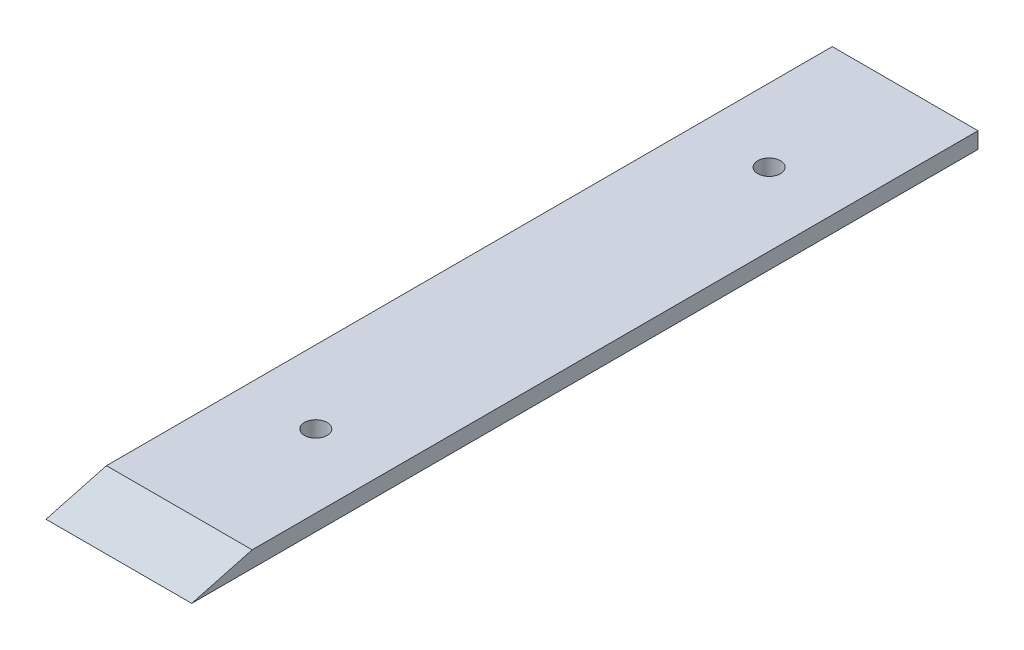
ISO-10303-21;
HEADER;
FILE_DESCRIPTION(('STEP AP214'),'2;1');
FILE_NAME('part.step','',(''),(''),'','','');
FILE_SCHEMA(('AUTOMOTIVE_DESIGN { 1 0 10303 214 1 1 1 1 }'));
ENDSEC;
DATA;
#1=APPLICATION_CONTEXT('core data for automotive mechanical design processes');
#2=APPLICATION_PROTOCOL_DEFINITION('international standard','automotive_design',2000,#1);
#3=PRODUCT_CONTEXT('',#1,'mechanical');
#4=PRODUCT('Part','Part','',(#3));
#5=PRODUCT_RELATED_PRODUCT_CATEGORY('part','',(#4));
#6=PRODUCT_DEFINITION_FORMATION('','',#4);
#7=PRODUCT_DEFINITION_CONTEXT('part definition',#1,'design');
#8=PRODUCT_DEFINITION('design','',#6,#7);
#9=PRODUCT_DEFINITION_SHAPE('','',#8);
#10=(LENGTH_UNIT() NAMED_UNIT(*) SI_UNIT(.MILLI.,.METRE.));
#11=(NAMED_UNIT(*) PLANE_ANGLE_UNIT() SI_UNIT($,.RADIAN.));
#12=(NAMED_UNIT(*) SI_UNIT($,.STERADIAN.) SOLID_ANGLE_UNIT());
#13=UNCERTAINTY_MEASURE_WITH_UNIT(LENGTH_MEASURE(1.E-05),#10,'distance_accuracy_value','');
#14=(GEOMETRIC_REPRESENTATION_CONTEXT(3) GLOBAL_UNCERTAINTY_ASSIGNED_CONTEXT((#13)) GLOBAL_UNIT_ASSIGNED_CONTEXT((#10,
#11,#12)) REPRESENTATION_CONTEXT('',''));
#15=CARTESIAN_POINT('',(0.,0.,0.));
#16=DIRECTION('',(0.,0.,1.));
#17=DIRECTION('',(1.,0.,0.));
#18=AXIS2_PLACEMENT_3D('',#15,#16,#17);
#19=CARTESIAN_POINT('',(22.5,-2.5,242.8));
#20=DIRECTION('',(-1.,0.,0.));
#21=DIRECTION('',(0.,0.,1.));
#22=AXIS2_PLACEMENT_3D('',#19,#20,#21);
#23=PLANE('',#22);
#24=DIRECTION('',(0.,0.,-1.));
#25=VECTOR('',#24,1.);
#26=CARTESIAN_POINT('',(22.5,2.5,242.8));
#27=LINE('',#26,#25);
#28=CARTESIAN_POINT('',(22.5,2.49999999999994,224.139745962156));
#29=VERTEX_POINT('',#28);
#30=CARTESIAN_POINT('',(22.5,2.5,0.));
#31=VERTEX_POINT('',#30);
#32=EDGE_CURVE('E11',#29,#31,#27,.T.);
#33=ORIENTED_EDGE('',*,*,#32,.F.);
#34=DIRECTION('',(0.,-0.258819045102522,0.965925826289068));
#35=VECTOR('',#34,1.);
#36=CARTESIAN_POINT('',(22.5,-2.5,242.8));
#37=LINE('',#36,#35);
#38=CARTESIAN_POINT('',(22.5,-2.5,242.8));
#39=VERTEX_POINT('',#38);
#40=EDGE_CURVE('E118',#29,#39,#37,.T.);
#41=ORIENTED_EDGE('',*,*,#40,.T.);
#42=DIRECTION('',(0.,0.,-1.));
#43=VECTOR('',#42,1.);
#44=CARTESIAN_POINT('',(22.5,-2.5,242.8));
#45=LINE('',#44,#43);
#46=CARTESIAN_POINT('',(22.5,-2.5,0.));
#47=VERTEX_POINT('',#46);
#48=EDGE_CURVE('E98',#39,#47,#45,.T.);
#49=ORIENTED_EDGE('',*,*,#48,.T.);
#50=DIRECTION('',(0.,1.,0.));
#51=VECTOR('',#50,1.);
#52=CARTESIAN_POINT('',(22.5,-2.5,0.));
#53=LINE('',#52,#51);
#54=EDGE_CURVE('E103',#47,#31,#53,.T.);
#55=ORIENTED_EDGE('',*,*,#54,.T.);
#56=EDGE_LOOP('',(#33,#41,#49,#55));
#57=FACE_BOUND('',#56,.T.);
#58=ADVANCED_FACE('F45',(#57),#23,.F.);
#59=CARTESIAN_POINT('',(-22.5,2.5,242.8));
#60=DIRECTION('',(0.,-1.,0.));
#61=DIRECTION('',(0.,0.,-1.));
#62=AXIS2_PLACEMENT_3D('',#59,#60,#61);
#63=PLANE('',#62);
#64=CARTESIAN_POINT('',(0.,2.5,42.));
#65=DIRECTION('',(0.,-1.,0.));
#66=DIRECTION('',(0.,0.,-1.));
#67=AXIS2_PLACEMENT_3D('',#64,#65,#66);
#68=CIRCLE('',#67,3.5);
#69=CARTESIAN_POINT('',(0.,2.5,38.5));
#70=VERTEX_POINT('',#69);
#71=EDGE_CURVE('E138',#70,#70,#68,.T.);
#72=ORIENTED_EDGE('',*,*,#71,.T.);
#73=EDGE_LOOP('',(#72));
#74=FACE_BOUND('',#73,.T.);
#75=CARTESIAN_POINT('',(1.4629931512765E-12,2.5,182.));
#76=DIRECTION('',(0.,-1.,0.));
#77=DIRECTION('',(0.,0.,-1.));
#78=AXIS2_PLACEMENT_3D('',#75,#76,#77);
#79=CIRCLE('',#78,3.5);
#80=CARTESIAN_POINT('',(1.4629931512765E-12,2.5,178.5));
#81=VERTEX_POINT('',#80);
#82=EDGE_CURVE('E144',#81,#81,#79,.T.);
#83=ORIENTED_EDGE('',*,*,#82,.T.);
#84=EDGE_LOOP('',(#83));
#85=FACE_BOUND('',#84,.T.);
#86=DIRECTION('',(0.,0.,-1.));
#87=VECTOR('',#86,1.);
#88=CARTESIAN_POINT('',(-22.5,2.5,242.8));
#89=LINE('',#88,#87);
#90=CARTESIAN_POINT('',(-22.5,2.49999999999994,224.139745962156));
#91=VERTEX_POINT('',#90);
#92=CARTESIAN_POINT('',(-22.5,2.5,0.));
#93=VERTEX_POINT('',#92);
#94=EDGE_CURVE('E48',#91,#93,#89,.T.);
#95=ORIENTED_EDGE('',*,*,#94,.F.);
#96=DIRECTION('',(-1.,0.,0.));
#97=VECTOR('',#96,1.);
#98=CARTESIAN_POINT('',(22.5,2.49999999999994,224.139745962156));
#99=LINE('',#98,#97);
#100=EDGE_CURVE('E122',#29,#91,#99,.T.);
#101=ORIENTED_EDGE('',*,*,#100,.F.);
#102=ORIENTED_EDGE('',*,*,#32,.T.);
#103=DIRECTION('',(-1.,0.,0.));
#104=VECTOR('',#103,1.);
#105=CARTESIAN_POINT('',(-22.5,2.5,0.));
#106=LINE('',#105,#104);
#107=EDGE_CURVE('E90',#31,#93,#106,.T.);
#108=ORIENTED_EDGE('',*,*,#107,.T.);
#109=EDGE_LOOP('',(#95,#101,#102,#108));
#110=FACE_BOUND('',#109,.T.);
#111=ADVANCED_FACE('F130',(#74,#85,#110),#63,.F.);
#112=CARTESIAN_POINT('',(-22.5,-2.5,242.8));
#113=DIRECTION('',(1.,0.,0.));
#114=DIRECTION('',(0.,0.,-1.));
#115=AXIS2_PLACEMENT_3D('',#112,#113,#114);
#116=PLANE('',#115);
#117=DIRECTION('',(0.,0.,-1.));
#118=VECTOR('',#117,1.);
#119=CARTESIAN_POINT('',(-22.5,-2.5,242.8));
#120=LINE('',#119,#118);
#121=CARTESIAN_POINT('',(-22.5,-2.5,242.8));
#122=VERTEX_POINT('',#121);
#123=CARTESIAN_POINT('',(-22.5,-2.5,0.));
#124=VERTEX_POINT('',#123);
#125=EDGE_CURVE('E81',#122,#124,#120,.T.);
#126=ORIENTED_EDGE('',*,*,#125,.F.);
#127=DIRECTION('',(0.,0.258819045102522,-0.965925826289068));
#128=VECTOR('',#127,1.);
#129=CARTESIAN_POINT('',(-22.5,-2.5,242.8));
#130=LINE('',#129,#128);
#131=EDGE_CURVE('E62',#122,#91,#130,.T.);
#132=ORIENTED_EDGE('',*,*,#131,.T.);
#133=ORIENTED_EDGE('',*,*,#94,.T.);
#134=DIRECTION('',(0.,-1.,0.));
#135=VECTOR('',#134,1.);
#136=CARTESIAN_POINT('',(-22.5,-2.5,0.));
#137=LINE('',#136,#135);
#138=EDGE_CURVE('E78',#93,#124,#137,.T.);
#139=ORIENTED_EDGE('',*,*,#138,.T.);
#140=EDGE_LOOP('',(#126,#132,#133,#139));
#141=FACE_BOUND('',#140,.T.);
#142=ADVANCED_FACE('F80',(#141),#116,.F.);
#143=CARTESIAN_POINT('',(-22.5,-2.5,242.8));
#144=DIRECTION('',(0.,1.,0.));
#145=DIRECTION('',(0.,0.,1.));
#146=AXIS2_PLACEMENT_3D('',#143,#144,#145);
#147=PLANE('',#146);
#148=CARTESIAN_POINT('',(0.,-2.5,42.));
#149=DIRECTION('',(0.,1.,0.));
#150=DIRECTION('',(0.,0.,1.));
#151=AXIS2_PLACEMENT_3D('',#148,#149,#150);
#152=CIRCLE('',#151,3.5);
#153=CARTESIAN_POINT('',(0.,-2.5,45.5));
#154=VERTEX_POINT('',#153);
#155=EDGE_CURVE('E148',#154,#154,#152,.T.);
#156=ORIENTED_EDGE('',*,*,#155,.T.);
#157=EDGE_LOOP('',(#156));
#158=FACE_BOUND('',#157,.T.);
#159=CARTESIAN_POINT('',(1.4629931512765E-12,-2.5,182.));
#160=DIRECTION('',(0.,1.,0.));
#161=DIRECTION('',(0.,0.,1.));
#162=AXIS2_PLACEMENT_3D('',#159,#160,#161);
#163=CIRCLE('',#162,3.5);
#164=CARTESIAN_POINT('',(1.4629931512765E-12,-2.5,185.5));
#165=VERTEX_POINT('',#164);
#166=EDGE_CURVE('E128',#165,#165,#163,.T.);
#167=ORIENTED_EDGE('',*,*,#166,.T.);
#168=EDGE_LOOP('',(#167));
#169=FACE_BOUND('',#168,.T.);
#170=DIRECTION('',(1.,0.,0.));
#171=VECTOR('',#170,1.);
#172=CARTESIAN_POINT('',(-22.5,-2.5,0.));
#173=LINE('',#172,#171);
#174=EDGE_CURVE('E89',#124,#47,#173,.T.);
#175=ORIENTED_EDGE('',*,*,#174,.T.);
#176=ORIENTED_EDGE('',*,*,#48,.F.);
#177=DIRECTION('',(1.,0.,0.));
#178=VECTOR('',#177,1.);
#179=CARTESIAN_POINT('',(-22.5,-2.5,242.8));
#180=LINE('',#179,#178);
#181=EDGE_CURVE('E96',#122,#39,#180,.T.);
#182=ORIENTED_EDGE('',*,*,#181,.F.);
#183=ORIENTED_EDGE('',*,*,#125,.T.);
#184=EDGE_LOOP('',(#175,#176,#182,#183));
#185=FACE_BOUND('',#184,.T.);
#186=ADVANCED_FACE('F93',(#158,#169,#185),#147,.F.);
#187=CARTESIAN_POINT('',(0.,0.,0.));
#188=DIRECTION('',(0.,0.,-1.));
#189=DIRECTION('',(-1.,0.,0.));
#190=AXIS2_PLACEMENT_3D('',#187,#188,#189);
#191=PLANE('',#190);
#192=ORIENTED_EDGE('',*,*,#54,.F.);
#193=ORIENTED_EDGE('',*,*,#174,.F.);
#194=ORIENTED_EDGE('',*,*,#138,.F.);
#195=ORIENTED_EDGE('',*,*,#107,.F.);
#196=EDGE_LOOP('',(#192,#193,#194,#195));
#197=FACE_BOUND('',#196,.T.);
#198=ADVANCED_FACE('F101',(#197),#191,.T.);
#199=CARTESIAN_POINT('',(1.4629931512765E-12,-2.5,182.));
#200=DIRECTION('',(0.,1.,0.));
#201=DIRECTION('',(0.,0.,1.));
#202=AXIS2_PLACEMENT_3D('',#199,#200,#201);
#203=CYLINDRICAL_SURFACE('',#202,3.5);
#204=ORIENTED_EDGE('',*,*,#166,.F.);
#205=EDGE_LOOP('',(#204));
#206=FACE_BOUND('',#205,.T.);
#207=ORIENTED_EDGE('',*,*,#82,.F.);
#208=EDGE_LOOP('',(#207));
#209=FACE_BOUND('',#208,.T.);
#210=ADVANCED_FACE('F175',(#206,#209),#203,.F.);
#211=CARTESIAN_POINT('',(0.,-2.5,42.));
#212=DIRECTION('',(0.,1.,0.));
#213=DIRECTION('',(0.,0.,1.));
#214=AXIS2_PLACEMENT_3D('',#211,#212,#213);
#215=CYLINDRICAL_SURFACE('',#214,3.5);
#216=ORIENTED_EDGE('',*,*,#155,.F.);
#217=EDGE_LOOP('',(#216));
#218=FACE_BOUND('',#217,.T.);
#219=ORIENTED_EDGE('',*,*,#71,.F.);
#220=EDGE_LOOP('',(#219));
#221=FACE_BOUND('',#220,.T.);
#222=ADVANCED_FACE('F172',(#218,#221),#215,.F.);
#223=CARTESIAN_POINT('',(22.5,-2.5,242.8));
#224=DIRECTION('',(0.,-0.965925826289068,-0.258819045102522));
#225=DIRECTION('',(0.,0.258819045102522,-0.965925826289068));
#226=AXIS2_PLACEMENT_3D('',#223,#224,#225);
#227=PLANE('',#226);
#228=ORIENTED_EDGE('',*,*,#181,.T.);
#229=ORIENTED_EDGE('',*,*,#40,.F.);
#230=ORIENTED_EDGE('',*,*,#100,.T.);
#231=ORIENTED_EDGE('',*,*,#131,.F.);
#232=EDGE_LOOP('',(#228,#229,#230,#231));
#233=FACE_BOUND('',#232,.T.);
#234=ADVANCED_FACE('F123',(#233),#227,.F.);
#235=CLOSED_SHELL('',(#58,#111,#142,#186,#198,#210,#222,#234));
#236=MANIFOLD_SOLID_BREP('B2',#235);
#237=ADVANCED_BREP_SHAPE_REPRESENTATION('',(#18,#236),#14);
#238=SHAPE_DEFINITION_REPRESENTATION(#9,#237);
ENDSEC;
END-ISO-10303-21;
